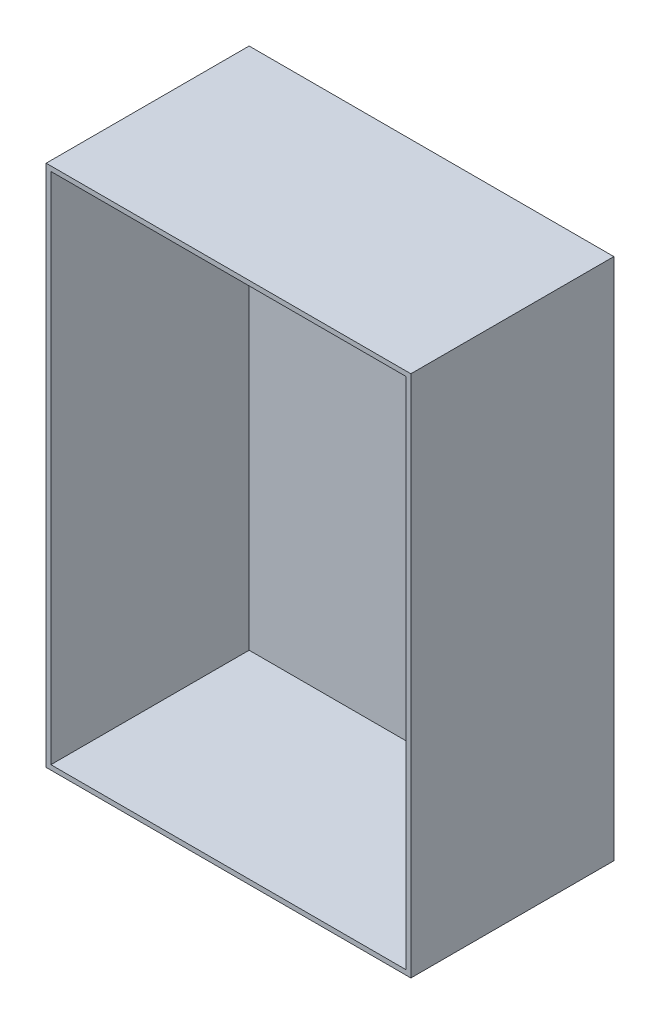
ISO-10303-21;
HEADER;
FILE_DESCRIPTION(('STEP AP214'),'2;1');
FILE_NAME('part.step','',(''),(''),'','','');
FILE_SCHEMA(('AUTOMOTIVE_DESIGN { 1 0 10303 214 1 1 1 1 }'));
ENDSEC;
DATA;
#1=APPLICATION_CONTEXT('core data for automotive mechanical design processes');
#2=APPLICATION_PROTOCOL_DEFINITION('international standard','automotive_design',2000,#1);
#3=PRODUCT_CONTEXT('',#1,'mechanical');
#4=PRODUCT('Part','Part','',(#3));
#5=PRODUCT_RELATED_PRODUCT_CATEGORY('part','',(#4));
#6=PRODUCT_DEFINITION_FORMATION('','',#4);
#7=PRODUCT_DEFINITION_CONTEXT('part definition',#1,'design');
#8=PRODUCT_DEFINITION('design','',#6,#7);
#9=PRODUCT_DEFINITION_SHAPE('','',#8);
#10=(LENGTH_UNIT() NAMED_UNIT(*) SI_UNIT(.MILLI.,.METRE.));
#11=(NAMED_UNIT(*) PLANE_ANGLE_UNIT() SI_UNIT($,.RADIAN.));
#12=(NAMED_UNIT(*) SI_UNIT($,.STERADIAN.) SOLID_ANGLE_UNIT());
#13=UNCERTAINTY_MEASURE_WITH_UNIT(LENGTH_MEASURE(1.E-05),#10,'distance_accuracy_value','');
#14=(GEOMETRIC_REPRESENTATION_CONTEXT(3) GLOBAL_UNCERTAINTY_ASSIGNED_CONTEXT((#13)) GLOBAL_UNIT_ASSIGNED_CONTEXT((#10,
#11,#12)) REPRESENTATION_CONTEXT('',''));
#15=CARTESIAN_POINT('',(0.,0.,0.));
#16=DIRECTION('',(0.,0.,1.));
#17=DIRECTION('',(1.,0.,0.));
#18=AXIS2_PLACEMENT_3D('',#15,#16,#17);
#19=CARTESIAN_POINT('',(0.,0.,128.));
#20=DIRECTION('',(0.,0.,-1.));
#21=DIRECTION('',(-1.,0.,0.));
#22=AXIS2_PLACEMENT_3D('',#19,#20,#21);
#23=PLANE('',#22);
#24=DIRECTION('',(0.,-1.,0.));
#25=VECTOR('',#24,1.);
#26=CARTESIAN_POINT('',(0.,0.,128.));
#27=LINE('',#26,#25);
#28=CARTESIAN_POINT('',(0.,330.,128.));
#29=VERTEX_POINT('',#28);
#30=CARTESIAN_POINT('',(0.,0.,128.));
#31=VERTEX_POINT('',#30);
#32=EDGE_CURVE('E141',#29,#31,#27,.T.);
#33=ORIENTED_EDGE('',*,*,#32,.T.);
#34=DIRECTION('',(1.,0.,0.));
#35=VECTOR('',#34,1.);
#36=CARTESIAN_POINT('',(0.,0.,128.));
#37=LINE('',#36,#35);
#38=CARTESIAN_POINT('',(230.,0.,128.));
#39=VERTEX_POINT('',#38);
#40=EDGE_CURVE('E143',#31,#39,#37,.T.);
#41=ORIENTED_EDGE('',*,*,#40,.T.);
#42=DIRECTION('',(0.,1.,0.));
#43=VECTOR('',#42,1.);
#44=CARTESIAN_POINT('',(230.,0.,128.));
#45=LINE('',#44,#43);
#46=CARTESIAN_POINT('',(230.,330.,128.));
#47=VERTEX_POINT('',#46);
#48=EDGE_CURVE('E150',#39,#47,#45,.T.);
#49=ORIENTED_EDGE('',*,*,#48,.T.);
#50=DIRECTION('',(-1.,0.,0.));
#51=VECTOR('',#50,1.);
#52=CARTESIAN_POINT('',(0.,330.,128.));
#53=LINE('',#52,#51);
#54=EDGE_CURVE('E146',#47,#29,#53,.T.);
#55=ORIENTED_EDGE('',*,*,#54,.T.);
#56=EDGE_LOOP('',(#33,#41,#49,#55));
#57=FACE_BOUND('',#56,.T.);
#58=DIRECTION('',(0.,-1.,0.));
#59=VECTOR('',#58,1.);
#60=CARTESIAN_POINT('',(3.,3.,128.));
#61=LINE('',#60,#59);
#62=CARTESIAN_POINT('',(3.,327.,128.));
#63=VERTEX_POINT('',#62);
#64=CARTESIAN_POINT('',(3.,3.,128.));
#65=VERTEX_POINT('',#64);
#66=EDGE_CURVE('E125',#63,#65,#61,.T.);
#67=ORIENTED_EDGE('',*,*,#66,.F.);
#68=DIRECTION('',(-1.,0.,0.));
#69=VECTOR('',#68,1.);
#70=CARTESIAN_POINT('',(3.,327.,128.));
#71=LINE('',#70,#69);
#72=CARTESIAN_POINT('',(227.,327.,128.));
#73=VERTEX_POINT('',#72);
#74=EDGE_CURVE('E115',#73,#63,#71,.T.);
#75=ORIENTED_EDGE('',*,*,#74,.F.);
#76=DIRECTION('',(0.,1.,0.));
#77=VECTOR('',#76,1.);
#78=CARTESIAN_POINT('',(227.,3.,128.));
#79=LINE('',#78,#77);
#80=CARTESIAN_POINT('',(227.,3.,128.));
#81=VERTEX_POINT('',#80);
#82=EDGE_CURVE('E135',#81,#73,#79,.T.);
#83=ORIENTED_EDGE('',*,*,#82,.F.);
#84=DIRECTION('',(1.,0.,0.));
#85=VECTOR('',#84,1.);
#86=CARTESIAN_POINT('',(3.,3.,128.));
#87=LINE('',#86,#85);
#88=EDGE_CURVE('E128',#65,#81,#87,.T.);
#89=ORIENTED_EDGE('',*,*,#88,.F.);
#90=EDGE_LOOP('',(#67,#75,#83,#89));
#91=FACE_BOUND('',#90,.T.);
#92=ADVANCED_FACE('F39',(#57,#91),#23,.F.);
#93=CARTESIAN_POINT('',(0.,0.,0.));
#94=DIRECTION('',(0.,0.,-1.));
#95=DIRECTION('',(-1.,0.,0.));
#96=AXIS2_PLACEMENT_3D('',#93,#94,#95);
#97=PLANE('',#96);
#98=DIRECTION('',(0.,-1.,0.));
#99=VECTOR('',#98,1.);
#100=CARTESIAN_POINT('',(0.,0.,0.));
#101=LINE('',#100,#99);
#102=CARTESIAN_POINT('',(0.,330.,0.));
#103=VERTEX_POINT('',#102);
#104=CARTESIAN_POINT('',(0.,0.,0.));
#105=VERTEX_POINT('',#104);
#106=EDGE_CURVE('E139',#103,#105,#101,.T.);
#107=ORIENTED_EDGE('',*,*,#106,.F.);
#108=DIRECTION('',(-1.,0.,0.));
#109=VECTOR('',#108,1.);
#110=CARTESIAN_POINT('',(0.,330.,0.));
#111=LINE('',#110,#109);
#112=CARTESIAN_POINT('',(230.,330.,0.));
#113=VERTEX_POINT('',#112);
#114=EDGE_CURVE('E144',#113,#103,#111,.T.);
#115=ORIENTED_EDGE('',*,*,#114,.F.);
#116=DIRECTION('',(0.,1.,0.));
#117=VECTOR('',#116,1.);
#118=CARTESIAN_POINT('',(230.,0.,0.));
#119=LINE('',#118,#117);
#120=CARTESIAN_POINT('',(230.,0.,0.));
#121=VERTEX_POINT('',#120);
#122=EDGE_CURVE('E157',#121,#113,#119,.T.);
#123=ORIENTED_EDGE('',*,*,#122,.F.);
#124=DIRECTION('',(1.,0.,0.));
#125=VECTOR('',#124,1.);
#126=CARTESIAN_POINT('',(0.,0.,0.));
#127=LINE('',#126,#125);
#128=EDGE_CURVE('E152',#105,#121,#127,.T.);
#129=ORIENTED_EDGE('',*,*,#128,.F.);
#130=EDGE_LOOP('',(#107,#115,#123,#129));
#131=FACE_BOUND('',#130,.T.);
#132=ADVANCED_FACE('F174',(#131),#97,.T.);
#133=CARTESIAN_POINT('',(0.,0.,128.));
#134=DIRECTION('',(1.,0.,0.));
#135=DIRECTION('',(0.,0.,-1.));
#136=AXIS2_PLACEMENT_3D('',#133,#134,#135);
#137=PLANE('',#136);
#138=ORIENTED_EDGE('',*,*,#106,.T.);
#139=DIRECTION('',(0.,0.,-1.));
#140=VECTOR('',#139,1.);
#141=CARTESIAN_POINT('',(0.,0.,128.));
#142=LINE('',#141,#140);
#143=EDGE_CURVE('E11',#31,#105,#142,.T.);
#144=ORIENTED_EDGE('',*,*,#143,.F.);
#145=ORIENTED_EDGE('',*,*,#32,.F.);
#146=DIRECTION('',(0.,0.,-1.));
#147=VECTOR('',#146,1.);
#148=CARTESIAN_POINT('',(0.,330.,128.));
#149=LINE('',#148,#147);
#150=EDGE_CURVE('E153',#29,#103,#149,.T.);
#151=ORIENTED_EDGE('',*,*,#150,.T.);
#152=EDGE_LOOP('',(#138,#144,#145,#151));
#153=FACE_BOUND('',#152,.T.);
#154=ADVANCED_FACE('F41',(#153),#137,.F.);
#155=CARTESIAN_POINT('',(0.,0.,128.));
#156=DIRECTION('',(0.,1.,0.));
#157=DIRECTION('',(0.,0.,1.));
#158=AXIS2_PLACEMENT_3D('',#155,#156,#157);
#159=PLANE('',#158);
#160=ORIENTED_EDGE('',*,*,#128,.T.);
#161=DIRECTION('',(0.,0.,-1.));
#162=VECTOR('',#161,1.);
#163=CARTESIAN_POINT('',(230.,0.,128.));
#164=LINE('',#163,#162);
#165=EDGE_CURVE('E50',#39,#121,#164,.T.);
#166=ORIENTED_EDGE('',*,*,#165,.F.);
#167=ORIENTED_EDGE('',*,*,#40,.F.);
#168=ORIENTED_EDGE('',*,*,#143,.T.);
#169=EDGE_LOOP('',(#160,#166,#167,#168));
#170=FACE_BOUND('',#169,.T.);
#171=ADVANCED_FACE('F182',(#170),#159,.F.);
#172=CARTESIAN_POINT('',(230.,0.,128.));
#173=DIRECTION('',(-1.,0.,0.));
#174=DIRECTION('',(0.,0.,1.));
#175=AXIS2_PLACEMENT_3D('',#172,#173,#174);
#176=PLANE('',#175);
#177=ORIENTED_EDGE('',*,*,#122,.T.);
#178=DIRECTION('',(0.,0.,-1.));
#179=VECTOR('',#178,1.);
#180=CARTESIAN_POINT('',(230.,330.,128.));
#181=LINE('',#180,#179);
#182=EDGE_CURVE('E163',#47,#113,#181,.T.);
#183=ORIENTED_EDGE('',*,*,#182,.F.);
#184=ORIENTED_EDGE('',*,*,#48,.F.);
#185=ORIENTED_EDGE('',*,*,#165,.T.);
#186=EDGE_LOOP('',(#177,#183,#184,#185));
#187=FACE_BOUND('',#186,.T.);
#188=ADVANCED_FACE('F166',(#187),#176,.F.);
#189=CARTESIAN_POINT('',(0.,330.,128.));
#190=DIRECTION('',(0.,-1.,0.));
#191=DIRECTION('',(0.,0.,-1.));
#192=AXIS2_PLACEMENT_3D('',#189,#190,#191);
#193=PLANE('',#192);
#194=ORIENTED_EDGE('',*,*,#114,.T.);
#195=ORIENTED_EDGE('',*,*,#150,.F.);
#196=ORIENTED_EDGE('',*,*,#54,.F.);
#197=ORIENTED_EDGE('',*,*,#182,.T.);
#198=EDGE_LOOP('',(#194,#195,#196,#197));
#199=FACE_BOUND('',#198,.T.);
#200=ADVANCED_FACE('F180',(#199),#193,.F.);
#201=CARTESIAN_POINT('',(3.,3.,128.));
#202=DIRECTION('',(1.,0.,0.));
#203=DIRECTION('',(0.,0.,-1.));
#204=AXIS2_PLACEMENT_3D('',#201,#202,#203);
#205=PLANE('',#204);
#206=DIRECTION('',(0.,-1.,0.));
#207=VECTOR('',#206,1.);
#208=CARTESIAN_POINT('',(3.,3.,3.));
#209=LINE('',#208,#207);
#210=CARTESIAN_POINT('',(3.,327.,3.));
#211=VERTEX_POINT('',#210);
#212=CARTESIAN_POINT('',(3.,3.,3.));
#213=VERTEX_POINT('',#212);
#214=EDGE_CURVE('E116',#211,#213,#209,.T.);
#215=ORIENTED_EDGE('',*,*,#214,.F.);
#216=DIRECTION('',(0.,0.,-1.));
#217=VECTOR('',#216,1.);
#218=CARTESIAN_POINT('',(3.,327.,128.));
#219=LINE('',#218,#217);
#220=EDGE_CURVE('E108',#63,#211,#219,.T.);
#221=ORIENTED_EDGE('',*,*,#220,.F.);
#222=ORIENTED_EDGE('',*,*,#66,.T.);
#223=DIRECTION('',(0.,0.,-1.));
#224=VECTOR('',#223,1.);
#225=CARTESIAN_POINT('',(3.,3.,128.));
#226=LINE('',#225,#224);
#227=EDGE_CURVE('E119',#65,#213,#226,.T.);
#228=ORIENTED_EDGE('',*,*,#227,.T.);
#229=EDGE_LOOP('',(#215,#221,#222,#228));
#230=FACE_BOUND('',#229,.T.);
#231=ADVANCED_FACE('F117',(#230),#205,.T.);
#232=CARTESIAN_POINT('',(3.,3.,128.));
#233=DIRECTION('',(0.,1.,0.));
#234=DIRECTION('',(0.,0.,1.));
#235=AXIS2_PLACEMENT_3D('',#232,#233,#234);
#236=PLANE('',#235);
#237=DIRECTION('',(1.,0.,0.));
#238=VECTOR('',#237,1.);
#239=CARTESIAN_POINT('',(3.,3.,3.));
#240=LINE('',#239,#238);
#241=CARTESIAN_POINT('',(227.,3.,3.));
#242=VERTEX_POINT('',#241);
#243=EDGE_CURVE('E53',#213,#242,#240,.T.);
#244=ORIENTED_EDGE('',*,*,#243,.F.);
#245=ORIENTED_EDGE('',*,*,#227,.F.);
#246=ORIENTED_EDGE('',*,*,#88,.T.);
#247=DIRECTION('',(0.,0.,-1.));
#248=VECTOR('',#247,1.);
#249=CARTESIAN_POINT('',(227.,3.,128.));
#250=LINE('',#249,#248);
#251=EDGE_CURVE('E140',#81,#242,#250,.T.);
#252=ORIENTED_EDGE('',*,*,#251,.T.);
#253=EDGE_LOOP('',(#244,#245,#246,#252));
#254=FACE_BOUND('',#253,.T.);
#255=ADVANCED_FACE('F204',(#254),#236,.T.);
#256=CARTESIAN_POINT('',(227.,3.,128.));
#257=DIRECTION('',(-1.,0.,0.));
#258=DIRECTION('',(0.,0.,1.));
#259=AXIS2_PLACEMENT_3D('',#256,#257,#258);
#260=PLANE('',#259);
#261=DIRECTION('',(0.,1.,0.));
#262=VECTOR('',#261,1.);
#263=CARTESIAN_POINT('',(227.,3.,3.));
#264=LINE('',#263,#262);
#265=CARTESIAN_POINT('',(227.,327.,3.));
#266=VERTEX_POINT('',#265);
#267=EDGE_CURVE('E65',#242,#266,#264,.T.);
#268=ORIENTED_EDGE('',*,*,#267,.F.);
#269=ORIENTED_EDGE('',*,*,#251,.F.);
#270=ORIENTED_EDGE('',*,*,#82,.T.);
#271=DIRECTION('',(0.,0.,-1.));
#272=VECTOR('',#271,1.);
#273=CARTESIAN_POINT('',(227.,327.,128.));
#274=LINE('',#273,#272);
#275=EDGE_CURVE('E113',#73,#266,#274,.T.);
#276=ORIENTED_EDGE('',*,*,#275,.T.);
#277=EDGE_LOOP('',(#268,#269,#270,#276));
#278=FACE_BOUND('',#277,.T.);
#279=ADVANCED_FACE('F206',(#278),#260,.T.);
#280=CARTESIAN_POINT('',(3.,327.,128.));
#281=DIRECTION('',(0.,-1.,0.));
#282=DIRECTION('',(0.,0.,-1.));
#283=AXIS2_PLACEMENT_3D('',#280,#281,#282);
#284=PLANE('',#283);
#285=DIRECTION('',(-1.,0.,0.));
#286=VECTOR('',#285,1.);
#287=CARTESIAN_POINT('',(3.,327.,3.));
#288=LINE('',#287,#286);
#289=EDGE_CURVE('E109',#266,#211,#288,.T.);
#290=ORIENTED_EDGE('',*,*,#289,.F.);
#291=ORIENTED_EDGE('',*,*,#275,.F.);
#292=ORIENTED_EDGE('',*,*,#74,.T.);
#293=ORIENTED_EDGE('',*,*,#220,.T.);
#294=EDGE_LOOP('',(#290,#291,#292,#293));
#295=FACE_BOUND('',#294,.T.);
#296=ADVANCED_FACE('F106',(#295),#284,.T.);
#297=CARTESIAN_POINT('',(0.,0.,3.));
#298=DIRECTION('',(0.,0.,-1.));
#299=DIRECTION('',(-1.,0.,0.));
#300=AXIS2_PLACEMENT_3D('',#297,#298,#299);
#301=PLANE('',#300);
#302=ORIENTED_EDGE('',*,*,#214,.T.);
#303=ORIENTED_EDGE('',*,*,#243,.T.);
#304=ORIENTED_EDGE('',*,*,#267,.T.);
#305=ORIENTED_EDGE('',*,*,#289,.T.);
#306=EDGE_LOOP('',(#302,#303,#304,#305));
#307=FACE_BOUND('',#306,.T.);
#308=ADVANCED_FACE('F121',(#307),#301,.F.);
#309=CLOSED_SHELL('',(#92,#132,#154,#171,#188,#200,#231,#255,#279,#296,#308));
#310=MANIFOLD_SOLID_BREP('B2',#309);
#311=ADVANCED_BREP_SHAPE_REPRESENTATION('',(#18,#310),#14);
#312=SHAPE_DEFINITION_REPRESENTATION(#9,#311);
ENDSEC;
END-ISO-10303-21;
